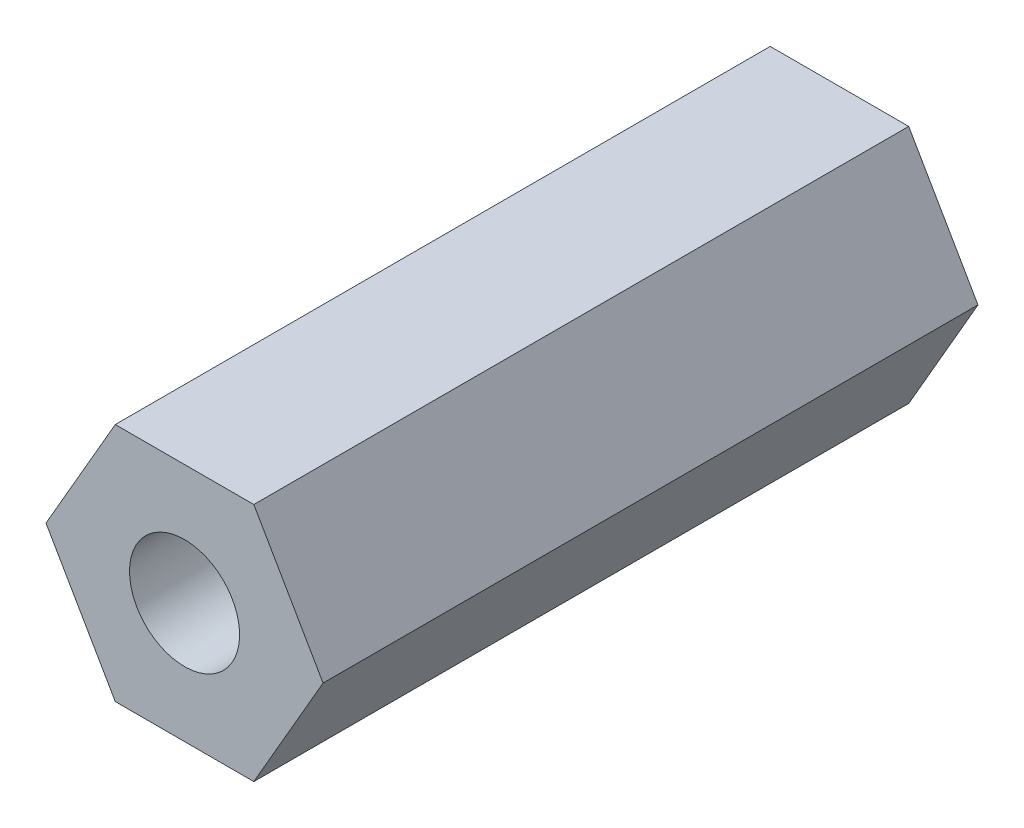
ISO-10303-21;
HEADER;
FILE_DESCRIPTION(('STEP AP214'),'2;1');
FILE_NAME('part.step','',(''),(''),'','','');
FILE_SCHEMA(('AUTOMOTIVE_DESIGN { 1 0 10303 214 1 1 1 1 }'));
ENDSEC;
DATA;
#1=APPLICATION_CONTEXT('core data for automotive mechanical design processes');
#2=APPLICATION_PROTOCOL_DEFINITION('international standard','automotive_design',2000,#1);
#3=PRODUCT_CONTEXT('',#1,'mechanical');
#4=PRODUCT('Part','Part','',(#3));
#5=PRODUCT_RELATED_PRODUCT_CATEGORY('part','',(#4));
#6=PRODUCT_DEFINITION_FORMATION('','',#4);
#7=PRODUCT_DEFINITION_CONTEXT('part definition',#1,'design');
#8=PRODUCT_DEFINITION('design','',#6,#7);
#9=PRODUCT_DEFINITION_SHAPE('','',#8);
#10=(LENGTH_UNIT() NAMED_UNIT(*) SI_UNIT(.MILLI.,.METRE.));
#11=(NAMED_UNIT(*) PLANE_ANGLE_UNIT() SI_UNIT($,.RADIAN.));
#12=(NAMED_UNIT(*) SI_UNIT($,.STERADIAN.) SOLID_ANGLE_UNIT());
#13=UNCERTAINTY_MEASURE_WITH_UNIT(LENGTH_MEASURE(1.E-05),#10,'distance_accuracy_value','');
#14=(GEOMETRIC_REPRESENTATION_CONTEXT(3) GLOBAL_UNCERTAINTY_ASSIGNED_CONTEXT((#13)) GLOBAL_UNIT_ASSIGNED_CONTEXT((#10,
#11,#12)) REPRESENTATION_CONTEXT('',''));
#15=CARTESIAN_POINT('',(0.,0.,0.));
#16=DIRECTION('',(0.,0.,1.));
#17=DIRECTION('',(1.,0.,0.));
#18=AXIS2_PLACEMENT_3D('',#15,#16,#17);
#19=CARTESIAN_POINT('',(-1.5984519552784,2.7686,15.113));
#20=DIRECTION('',(0.866025403784441,-0.499999999999996,0.));
#21=DIRECTION('',(0.499999999999996,0.866025403784441,0.));
#22=AXIS2_PLACEMENT_3D('',#19,#20,#21);
#23=PLANE('',#22);
#24=DIRECTION('',(-0.499999999999996,-0.866025403784441,0.));
#25=VECTOR('',#24,1.);
#26=CARTESIAN_POINT('',(-1.5984519552784,2.7686,0.));
#27=LINE('',#26,#25);
#28=CARTESIAN_POINT('',(-1.5984519552784,2.7686,0.));
#29=VERTEX_POINT('',#28);
#30=CARTESIAN_POINT('',(-3.19690391055678,0.,0.));
#31=VERTEX_POINT('',#30);
#32=EDGE_CURVE('E119',#29,#31,#27,.T.);
#33=ORIENTED_EDGE('',*,*,#32,.T.);
#34=DIRECTION('',(0.,0.,-1.));
#35=VECTOR('',#34,1.);
#36=CARTESIAN_POINT('',(-3.19690391055678,0.,15.113));
#37=LINE('',#36,#35);
#38=CARTESIAN_POINT('',(-3.19690391055678,0.,15.113));
#39=VERTEX_POINT('',#38);
#40=EDGE_CURVE('E11',#39,#31,#37,.T.);
#41=ORIENTED_EDGE('',*,*,#40,.F.);
#42=DIRECTION('',(-0.499999999999996,-0.866025403784441,0.));
#43=VECTOR('',#42,1.);
#44=CARTESIAN_POINT('',(-1.5984519552784,2.7686,15.113));
#45=LINE('',#44,#43);
#46=CARTESIAN_POINT('',(-1.5984519552784,2.7686,15.113));
#47=VERTEX_POINT('',#46);
#48=EDGE_CURVE('E130',#47,#39,#45,.T.);
#49=ORIENTED_EDGE('',*,*,#48,.F.);
#50=DIRECTION('',(0.,0.,-1.));
#51=VECTOR('',#50,1.);
#52=CARTESIAN_POINT('',(-1.5984519552784,2.7686,15.113));
#53=LINE('',#52,#51);
#54=EDGE_CURVE('E115',#47,#29,#53,.T.);
#55=ORIENTED_EDGE('',*,*,#54,.T.);
#56=EDGE_LOOP('',(#33,#41,#49,#55));
#57=FACE_BOUND('',#56,.T.);
#58=ADVANCED_FACE('F35',(#57),#23,.F.);
#59=CARTESIAN_POINT('',(-3.19690391055678,0.,15.113));
#60=DIRECTION('',(0.866025403784439,0.499999999999999,0.));
#61=DIRECTION('',(-0.499999999999999,0.866025403784439,0.));
#62=AXIS2_PLACEMENT_3D('',#59,#60,#61);
#63=PLANE('',#62);
#64=DIRECTION('',(0.499999999999999,-0.866025403784439,0.));
#65=VECTOR('',#64,1.);
#66=CARTESIAN_POINT('',(-3.19690391055678,0.,0.));
#67=LINE('',#66,#65);
#68=CARTESIAN_POINT('',(-1.5984519552784,-2.7686,0.));
#69=VERTEX_POINT('',#68);
#70=EDGE_CURVE('E122',#31,#69,#67,.T.);
#71=ORIENTED_EDGE('',*,*,#70,.T.);
#72=DIRECTION('',(0.,0.,-1.));
#73=VECTOR('',#72,1.);
#74=CARTESIAN_POINT('',(-1.5984519552784,-2.7686,15.113));
#75=LINE('',#74,#73);
#76=CARTESIAN_POINT('',(-1.5984519552784,-2.7686,15.113));
#77=VERTEX_POINT('',#76);
#78=EDGE_CURVE('E43',#77,#69,#75,.T.);
#79=ORIENTED_EDGE('',*,*,#78,.F.);
#80=DIRECTION('',(0.499999999999999,-0.866025403784439,0.));
#81=VECTOR('',#80,1.);
#82=CARTESIAN_POINT('',(-3.19690391055678,0.,15.113));
#83=LINE('',#82,#81);
#84=EDGE_CURVE('E88',#39,#77,#83,.T.);
#85=ORIENTED_EDGE('',*,*,#84,.F.);
#86=ORIENTED_EDGE('',*,*,#40,.T.);
#87=EDGE_LOOP('',(#71,#79,#85,#86));
#88=FACE_BOUND('',#87,.T.);
#89=ADVANCED_FACE('F155',(#88),#63,.F.);
#90=CARTESIAN_POINT('',(-1.5984519552784,-2.7686,15.113));
#91=DIRECTION('',(0.,1.,0.));
#92=DIRECTION('',(0.,0.,1.));
#93=AXIS2_PLACEMENT_3D('',#90,#91,#92);
#94=PLANE('',#93);
#95=DIRECTION('',(1.,0.,0.));
#96=VECTOR('',#95,1.);
#97=CARTESIAN_POINT('',(-1.5984519552784,-2.7686,0.));
#98=LINE('',#97,#96);
#99=CARTESIAN_POINT('',(1.5984519552784,-2.7686,0.));
#100=VERTEX_POINT('',#99);
#101=EDGE_CURVE('E125',#69,#100,#98,.T.);
#102=ORIENTED_EDGE('',*,*,#101,.T.);
#103=DIRECTION('',(0.,0.,-1.));
#104=VECTOR('',#103,1.);
#105=CARTESIAN_POINT('',(1.5984519552784,-2.7686,15.113));
#106=LINE('',#105,#104);
#107=CARTESIAN_POINT('',(1.5984519552784,-2.7686,15.113));
#108=VERTEX_POINT('',#107);
#109=EDGE_CURVE('E110',#108,#100,#106,.T.);
#110=ORIENTED_EDGE('',*,*,#109,.F.);
#111=DIRECTION('',(1.,0.,0.));
#112=VECTOR('',#111,1.);
#113=CARTESIAN_POINT('',(-1.5984519552784,-2.7686,15.113));
#114=LINE('',#113,#112);
#115=EDGE_CURVE('E101',#77,#108,#114,.T.);
#116=ORIENTED_EDGE('',*,*,#115,.F.);
#117=ORIENTED_EDGE('',*,*,#78,.T.);
#118=EDGE_LOOP('',(#102,#110,#116,#117));
#119=FACE_BOUND('',#118,.T.);
#120=ADVANCED_FACE('F136',(#119),#94,.F.);
#121=CARTESIAN_POINT('',(1.5984519552784,-2.7686,15.113));
#122=DIRECTION('',(-0.866025403784442,0.499999999999995,0.));
#123=DIRECTION('',(-0.499999999999995,-0.866025403784442,0.));
#124=AXIS2_PLACEMENT_3D('',#121,#122,#123);
#125=PLANE('',#124);
#126=DIRECTION('',(0.499999999999995,0.866025403784442,0.));
#127=VECTOR('',#126,1.);
#128=CARTESIAN_POINT('',(1.5984519552784,-2.7686,0.));
#129=LINE('',#128,#127);
#130=CARTESIAN_POINT('',(3.1969039105568,0.,0.));
#131=VERTEX_POINT('',#130);
#132=EDGE_CURVE('E109',#100,#131,#129,.T.);
#133=ORIENTED_EDGE('',*,*,#132,.T.);
#134=DIRECTION('',(0.,0.,-1.));
#135=VECTOR('',#134,1.);
#136=CARTESIAN_POINT('',(3.1969039105568,0.,15.113));
#137=LINE('',#136,#135);
#138=CARTESIAN_POINT('',(3.1969039105568,0.,15.113));
#139=VERTEX_POINT('',#138);
#140=EDGE_CURVE('E106',#139,#131,#137,.T.);
#141=ORIENTED_EDGE('',*,*,#140,.F.);
#142=DIRECTION('',(0.499999999999995,0.866025403784442,0.));
#143=VECTOR('',#142,1.);
#144=CARTESIAN_POINT('',(1.5984519552784,-2.7686,15.113));
#145=LINE('',#144,#143);
#146=EDGE_CURVE('E95',#108,#139,#145,.T.);
#147=ORIENTED_EDGE('',*,*,#146,.F.);
#148=ORIENTED_EDGE('',*,*,#109,.T.);
#149=EDGE_LOOP('',(#133,#141,#147,#148));
#150=FACE_BOUND('',#149,.T.);
#151=ADVANCED_FACE('F107',(#150),#125,.F.);
#152=CARTESIAN_POINT('',(3.1969039105568,0.,15.113));
#153=DIRECTION('',(-0.866025403784439,-0.5,0.));
#154=DIRECTION('',(0.5,-0.866025403784439,0.));
#155=AXIS2_PLACEMENT_3D('',#152,#153,#154);
#156=PLANE('',#155);
#157=DIRECTION('',(-0.5,0.866025403784438,0.));
#158=VECTOR('',#157,1.);
#159=CARTESIAN_POINT('',(3.1969039105568,0.,0.));
#160=LINE('',#159,#158);
#161=CARTESIAN_POINT('',(1.59845195527843,2.7686,0.));
#162=VERTEX_POINT('',#161);
#163=EDGE_CURVE('E74',#131,#162,#160,.T.);
#164=ORIENTED_EDGE('',*,*,#163,.T.);
#165=DIRECTION('',(0.,0.,-1.));
#166=VECTOR('',#165,1.);
#167=CARTESIAN_POINT('',(1.59845195527843,2.7686,15.113));
#168=LINE('',#167,#166);
#169=CARTESIAN_POINT('',(1.59845195527843,2.7686,15.113));
#170=VERTEX_POINT('',#169);
#171=EDGE_CURVE('E111',#170,#162,#168,.T.);
#172=ORIENTED_EDGE('',*,*,#171,.F.);
#173=DIRECTION('',(-0.5,0.866025403784438,0.));
#174=VECTOR('',#173,1.);
#175=CARTESIAN_POINT('',(3.1969039105568,0.,15.113));
#176=LINE('',#175,#174);
#177=EDGE_CURVE('E99',#139,#170,#176,.T.);
#178=ORIENTED_EDGE('',*,*,#177,.F.);
#179=ORIENTED_EDGE('',*,*,#140,.T.);
#180=EDGE_LOOP('',(#164,#172,#178,#179));
#181=FACE_BOUND('',#180,.T.);
#182=ADVANCED_FACE('F113',(#181),#156,.F.);
#183=CARTESIAN_POINT('',(1.59845195527843,2.7686,15.113));
#184=DIRECTION('',(0.,-1.,0.));
#185=DIRECTION('',(0.,0.,-1.));
#186=AXIS2_PLACEMENT_3D('',#183,#184,#185);
#187=PLANE('',#186);
#188=DIRECTION('',(-1.,0.,0.));
#189=VECTOR('',#188,1.);
#190=CARTESIAN_POINT('',(1.59845195527843,2.7686,0.));
#191=LINE('',#190,#189);
#192=EDGE_CURVE('E80',#162,#29,#191,.T.);
#193=ORIENTED_EDGE('',*,*,#192,.T.);
#194=ORIENTED_EDGE('',*,*,#54,.F.);
#195=DIRECTION('',(-1.,0.,0.));
#196=VECTOR('',#195,1.);
#197=CARTESIAN_POINT('',(1.59845195527843,2.7686,15.113));
#198=LINE('',#197,#196);
#199=EDGE_CURVE('E51',#170,#47,#198,.T.);
#200=ORIENTED_EDGE('',*,*,#199,.F.);
#201=ORIENTED_EDGE('',*,*,#171,.T.);
#202=EDGE_LOOP('',(#193,#194,#200,#201));
#203=FACE_BOUND('',#202,.T.);
#204=ADVANCED_FACE('F143',(#203),#187,.F.);
#205=CARTESIAN_POINT('',(0.,0.,15.113));
#206=DIRECTION('',(0.,0.,1.));
#207=DIRECTION('',(1.,0.,0.));
#208=AXIS2_PLACEMENT_3D('',#205,#206,#207);
#209=PLANE('',#208);
#210=CARTESIAN_POINT('',(0.,0.,15.113));
#211=DIRECTION('',(0.,0.,-1.));
#212=DIRECTION('',(-1.,0.,0.));
#213=AXIS2_PLACEMENT_3D('',#210,#211,#212);
#214=CIRCLE('',#213,1.27);
#215=CARTESIAN_POINT('',(-1.27,0.,15.113));
#216=VERTEX_POINT('',#215);
#217=EDGE_CURVE('E123',#216,#216,#214,.T.);
#218=ORIENTED_EDGE('',*,*,#217,.T.);
#219=EDGE_LOOP('',(#218));
#220=FACE_BOUND('',#219,.T.);
#221=ORIENTED_EDGE('',*,*,#48,.T.);
#222=ORIENTED_EDGE('',*,*,#84,.T.);
#223=ORIENTED_EDGE('',*,*,#115,.T.);
#224=ORIENTED_EDGE('',*,*,#146,.T.);
#225=ORIENTED_EDGE('',*,*,#177,.T.);
#226=ORIENTED_EDGE('',*,*,#199,.T.);
#227=EDGE_LOOP('',(#221,#222,#223,#224,#225,#226));
#228=FACE_BOUND('',#227,.T.);
#229=ADVANCED_FACE('F97',(#220,#228),#209,.T.);
#230=CARTESIAN_POINT('',(0.,0.,0.));
#231=DIRECTION('',(0.,0.,1.));
#232=DIRECTION('',(1.,0.,0.));
#233=AXIS2_PLACEMENT_3D('',#230,#231,#232);
#234=PLANE('',#233);
#235=CARTESIAN_POINT('',(0.,0.,0.));
#236=DIRECTION('',(0.,0.,-1.));
#237=DIRECTION('',(-1.,0.,0.));
#238=AXIS2_PLACEMENT_3D('',#235,#236,#237);
#239=CIRCLE('',#238,1.27);
#240=CARTESIAN_POINT('',(-1.27,0.,0.));
#241=VERTEX_POINT('',#240);
#242=EDGE_CURVE('E210',#241,#241,#239,.T.);
#243=ORIENTED_EDGE('',*,*,#242,.F.);
#244=EDGE_LOOP('',(#243));
#245=FACE_BOUND('',#244,.T.);
#246=ORIENTED_EDGE('',*,*,#32,.F.);
#247=ORIENTED_EDGE('',*,*,#192,.F.);
#248=ORIENTED_EDGE('',*,*,#163,.F.);
#249=ORIENTED_EDGE('',*,*,#132,.F.);
#250=ORIENTED_EDGE('',*,*,#101,.F.);
#251=ORIENTED_EDGE('',*,*,#70,.F.);
#252=EDGE_LOOP('',(#246,#247,#248,#249,#250,#251));
#253=FACE_BOUND('',#252,.T.);
#254=ADVANCED_FACE('F139',(#245,#253),#234,.F.);
#255=CARTESIAN_POINT('',(0.,0.,15.113));
#256=DIRECTION('',(0.,0.,-1.));
#257=DIRECTION('',(-1.,0.,0.));
#258=AXIS2_PLACEMENT_3D('',#255,#256,#257);
#259=CYLINDRICAL_SURFACE('',#258,1.27);
#260=ORIENTED_EDGE('',*,*,#217,.F.);
#261=EDGE_LOOP('',(#260));
#262=FACE_BOUND('',#261,.T.);
#263=ORIENTED_EDGE('',*,*,#242,.T.);
#264=EDGE_LOOP('',(#263));
#265=FACE_BOUND('',#264,.T.);
#266=ADVANCED_FACE('F192',(#262,#265),#259,.F.);
#267=CLOSED_SHELL('',(#58,#89,#120,#151,#182,#204,#229,#254,#266));
#268=MANIFOLD_SOLID_BREP('B2',#267);
#269=ADVANCED_BREP_SHAPE_REPRESENTATION('',(#18,#268),#14);
#270=SHAPE_DEFINITION_REPRESENTATION(#9,#269);
ENDSEC;
END-ISO-10303-21;
